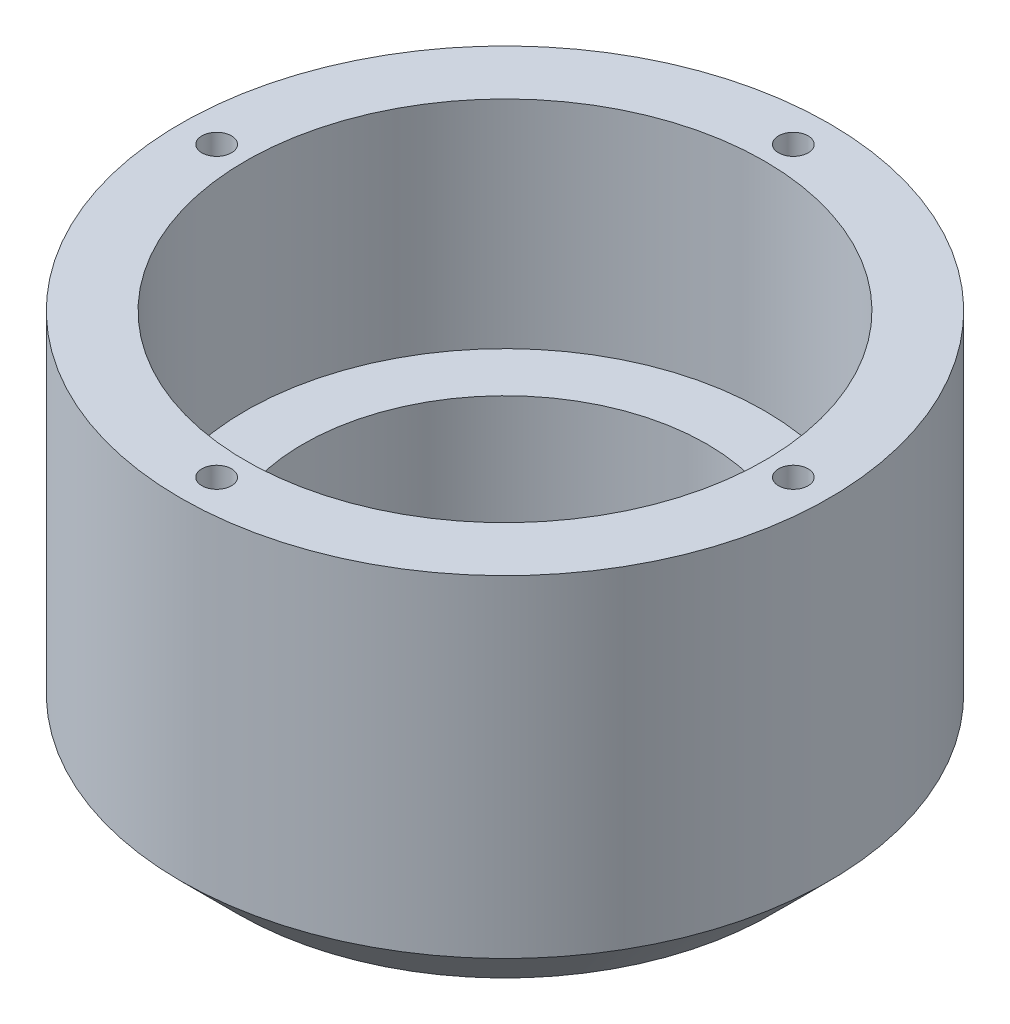
ISO-10303-21;
HEADER;
FILE_DESCRIPTION(('STEP AP214'),'2;1');
FILE_NAME('part.step','',(''),(''),'','','');
FILE_SCHEMA(('AUTOMOTIVE_DESIGN { 1 0 10303 214 1 1 1 1 }'));
ENDSEC;
DATA;
#1=APPLICATION_CONTEXT('core data for automotive mechanical design processes');
#2=APPLICATION_PROTOCOL_DEFINITION('international standard','automotive_design',2000,#1);
#3=PRODUCT_CONTEXT('',#1,'mechanical');
#4=PRODUCT('Part','Part','',(#3));
#5=PRODUCT_RELATED_PRODUCT_CATEGORY('part','',(#4));
#6=PRODUCT_DEFINITION_FORMATION('','',#4);
#7=PRODUCT_DEFINITION_CONTEXT('part definition',#1,'design');
#8=PRODUCT_DEFINITION('design','',#6,#7);
#9=PRODUCT_DEFINITION_SHAPE('','',#8);
#10=(LENGTH_UNIT() NAMED_UNIT(*) SI_UNIT(.MILLI.,.METRE.));
#11=(NAMED_UNIT(*) PLANE_ANGLE_UNIT() SI_UNIT($,.RADIAN.));
#12=(NAMED_UNIT(*) SI_UNIT($,.STERADIAN.) SOLID_ANGLE_UNIT());
#13=UNCERTAINTY_MEASURE_WITH_UNIT(LENGTH_MEASURE(1.E-05),#10,'distance_accuracy_value','');
#14=(GEOMETRIC_REPRESENTATION_CONTEXT(3) GLOBAL_UNCERTAINTY_ASSIGNED_CONTEXT((#13)) GLOBAL_UNIT_ASSIGNED_CONTEXT((#10,
#11,#12)) REPRESENTATION_CONTEXT('',''));
#15=CARTESIAN_POINT('',(0.,0.,0.));
#16=DIRECTION('',(0.,0.,1.));
#17=DIRECTION('',(1.,0.,0.));
#18=AXIS2_PLACEMENT_3D('',#15,#16,#17);
#19=CARTESIAN_POINT('',(0.,0.,0.));
#20=DIRECTION('',(0.,-1.,0.));
#21=DIRECTION('',(0.,0.,-1.));
#22=AXIS2_PLACEMENT_3D('',#19,#20,#21);
#23=CYLINDRICAL_SURFACE('',#22,18.);
#24=CARTESIAN_POINT('',(0.,15.,0.));
#25=DIRECTION('',(0.,-1.,0.));
#26=DIRECTION('',(0.,0.,-1.));
#27=AXIS2_PLACEMENT_3D('',#24,#25,#26);
#28=CIRCLE('',#27,18.);
#29=CARTESIAN_POINT('',(0.,15.,-18.));
#30=VERTEX_POINT('',#29);
#31=EDGE_CURVE('E111',#30,#30,#28,.T.);
#32=ORIENTED_EDGE('',*,*,#31,.F.);
#33=EDGE_LOOP('',(#32));
#34=FACE_BOUND('',#33,.T.);
#35=CARTESIAN_POINT('',(0.,0.,0.));
#36=DIRECTION('',(0.,-1.,0.));
#37=DIRECTION('',(0.,0.,-1.));
#38=AXIS2_PLACEMENT_3D('',#35,#36,#37);
#39=CIRCLE('',#38,18.);
#40=CARTESIAN_POINT('',(0.,0.,-18.));
#41=VERTEX_POINT('',#40);
#42=EDGE_CURVE('E95',#41,#41,#39,.T.);
#43=ORIENTED_EDGE('',*,*,#42,.T.);
#44=EDGE_LOOP('',(#43));
#45=FACE_BOUND('',#44,.T.);
#46=ADVANCED_FACE('F17',(#34,#45),#23,.F.);
#47=CARTESIAN_POINT('',(-22.5,15.,0.));
#48=DIRECTION('',(0.,-1.,0.));
#49=DIRECTION('',(0.,0.,-1.));
#50=AXIS2_PLACEMENT_3D('',#47,#48,#49);
#51=PLANE('',#50);
#52=CARTESIAN_POINT('',(-20.,15.,0.));
#53=DIRECTION('',(0.,1.,0.));
#54=DIRECTION('',(0.,0.,1.));
#55=AXIS2_PLACEMENT_3D('',#52,#53,#54);
#56=CIRCLE('',#55,1.025);
#57=CARTESIAN_POINT('',(-20.,15.,1.025));
#58=VERTEX_POINT('',#57);
#59=EDGE_CURVE('E65',#58,#58,#56,.T.);
#60=ORIENTED_EDGE('',*,*,#59,.F.);
#61=EDGE_LOOP('',(#60));
#62=FACE_BOUND('',#61,.T.);
#63=CARTESIAN_POINT('',(0.,15.,-20.));
#64=DIRECTION('',(0.,1.,0.));
#65=DIRECTION('',(0.,0.,1.));
#66=AXIS2_PLACEMENT_3D('',#63,#64,#65);
#67=CIRCLE('',#66,1.025);
#68=CARTESIAN_POINT('',(0.,15.,-18.975));
#69=VERTEX_POINT('',#68);
#70=EDGE_CURVE('E64',#69,#69,#67,.T.);
#71=ORIENTED_EDGE('',*,*,#70,.F.);
#72=EDGE_LOOP('',(#71));
#73=FACE_BOUND('',#72,.T.);
#74=CARTESIAN_POINT('',(20.,15.,1.39659253553725E-13));
#75=DIRECTION('',(0.,1.,0.));
#76=DIRECTION('',(0.,0.,1.));
#77=AXIS2_PLACEMENT_3D('',#74,#75,#76);
#78=CIRCLE('',#77,1.025);
#79=CARTESIAN_POINT('',(20.,15.,1.02500000000014));
#80=VERTEX_POINT('',#79);
#81=EDGE_CURVE('E79',#80,#80,#78,.T.);
#82=ORIENTED_EDGE('',*,*,#81,.F.);
#83=EDGE_LOOP('',(#82));
#84=FACE_BOUND('',#83,.T.);
#85=CARTESIAN_POINT('',(-2.09488880330588E-13,15.,20.));
#86=DIRECTION('',(0.,1.,0.));
#87=DIRECTION('',(0.,0.,1.));
#88=AXIS2_PLACEMENT_3D('',#85,#86,#87);
#89=CIRCLE('',#88,1.025);
#90=CARTESIAN_POINT('',(-2.09488880330588E-13,15.,21.025));
#91=VERTEX_POINT('',#90);
#92=EDGE_CURVE('E87',#91,#91,#89,.T.);
#93=ORIENTED_EDGE('',*,*,#92,.F.);
#94=EDGE_LOOP('',(#93));
#95=FACE_BOUND('',#94,.T.);
#96=CARTESIAN_POINT('',(0.,15.,0.));
#97=DIRECTION('',(0.,-1.,0.));
#98=DIRECTION('',(0.,0.,-1.));
#99=AXIS2_PLACEMENT_3D('',#96,#97,#98);
#100=CIRCLE('',#99,22.5);
#101=CARTESIAN_POINT('',(0.,15.,-22.5));
#102=VERTEX_POINT('',#101);
#103=EDGE_CURVE('E107',#102,#102,#100,.T.);
#104=ORIENTED_EDGE('',*,*,#103,.F.);
#105=EDGE_LOOP('',(#104));
#106=FACE_BOUND('',#105,.T.);
#107=ORIENTED_EDGE('',*,*,#31,.T.);
#108=EDGE_LOOP('',(#107));
#109=FACE_BOUND('',#108,.T.);
#110=ADVANCED_FACE('F131',(#62,#73,#84,#95,#106,#109),#51,.F.);
#111=CARTESIAN_POINT('',(0.,0.,0.));
#112=DIRECTION('',(0.,-1.,0.));
#113=DIRECTION('',(0.,0.,-1.));
#114=AXIS2_PLACEMENT_3D('',#111,#112,#113);
#115=CYLINDRICAL_SURFACE('',#114,22.5);
#116=CARTESIAN_POINT('',(0.,-8.,0.));
#117=DIRECTION('',(0.,1.,0.));
#118=DIRECTION('',(0.,0.,1.));
#119=AXIS2_PLACEMENT_3D('',#116,#117,#118);
#120=CIRCLE('',#119,22.5);
#121=CARTESIAN_POINT('',(0.,-8.,22.5));
#122=VERTEX_POINT('',#121);
#123=EDGE_CURVE('E11',#122,#122,#120,.T.);
#124=ORIENTED_EDGE('',*,*,#123,.T.);
#125=EDGE_LOOP('',(#124));
#126=FACE_BOUND('',#125,.T.);
#127=ORIENTED_EDGE('',*,*,#103,.T.);
#128=EDGE_LOOP('',(#127));
#129=FACE_BOUND('',#128,.T.);
#130=ADVANCED_FACE('F136',(#126,#129),#115,.T.);
#131=CARTESIAN_POINT('',(-14.,-12.,0.));
#132=DIRECTION('',(0.,1.,0.));
#133=DIRECTION('',(0.,0.,1.));
#134=AXIS2_PLACEMENT_3D('',#131,#132,#133);
#135=PLANE('',#134);
#136=CARTESIAN_POINT('',(0.,-12.,0.));
#137=DIRECTION('',(0.,1.,0.));
#138=DIRECTION('',(0.,0.,1.));
#139=AXIS2_PLACEMENT_3D('',#136,#137,#138);
#140=CIRCLE('',#139,18.5);
#141=CARTESIAN_POINT('',(0.,-12.,18.5));
#142=VERTEX_POINT('',#141);
#143=EDGE_CURVE('E26',#142,#142,#140,.F.);
#144=ORIENTED_EDGE('',*,*,#143,.T.);
#145=EDGE_LOOP('',(#144));
#146=FACE_BOUND('',#145,.T.);
#147=CARTESIAN_POINT('',(0.,-12.,0.));
#148=DIRECTION('',(0.,-1.,0.));
#149=DIRECTION('',(0.,0.,-1.));
#150=AXIS2_PLACEMENT_3D('',#147,#148,#149);
#151=CIRCLE('',#150,14.);
#152=CARTESIAN_POINT('',(0.,-12.,-14.));
#153=VERTEX_POINT('',#152);
#154=EDGE_CURVE('E103',#153,#153,#151,.T.);
#155=ORIENTED_EDGE('',*,*,#154,.F.);
#156=EDGE_LOOP('',(#155));
#157=FACE_BOUND('',#156,.T.);
#158=ADVANCED_FACE('F119',(#146,#157),#135,.F.);
#159=CARTESIAN_POINT('',(0.,0.,0.));
#160=DIRECTION('',(0.,-1.,0.));
#161=DIRECTION('',(0.,0.,-1.));
#162=AXIS2_PLACEMENT_3D('',#159,#160,#161);
#163=CYLINDRICAL_SURFACE('',#162,14.);
#164=CARTESIAN_POINT('',(0.,0.,0.));
#165=DIRECTION('',(0.,-1.,0.));
#166=DIRECTION('',(0.,0.,-1.));
#167=AXIS2_PLACEMENT_3D('',#164,#165,#166);
#168=CIRCLE('',#167,14.);
#169=CARTESIAN_POINT('',(0.,0.,-14.));
#170=VERTEX_POINT('',#169);
#171=EDGE_CURVE('E99',#170,#170,#168,.T.);
#172=ORIENTED_EDGE('',*,*,#171,.F.);
#173=EDGE_LOOP('',(#172));
#174=FACE_BOUND('',#173,.T.);
#175=ORIENTED_EDGE('',*,*,#154,.T.);
#176=EDGE_LOOP('',(#175));
#177=FACE_BOUND('',#176,.T.);
#178=ADVANCED_FACE('F147',(#174,#177),#163,.F.);
#179=CARTESIAN_POINT('',(-18.,0.,0.));
#180=DIRECTION('',(0.,-1.,0.));
#181=DIRECTION('',(0.,0.,-1.));
#182=AXIS2_PLACEMENT_3D('',#179,#180,#181);
#183=PLANE('',#182);
#184=ORIENTED_EDGE('',*,*,#42,.F.);
#185=EDGE_LOOP('',(#184));
#186=FACE_BOUND('',#185,.T.);
#187=ORIENTED_EDGE('',*,*,#171,.T.);
#188=EDGE_LOOP('',(#187));
#189=FACE_BOUND('',#188,.T.);
#190=ADVANCED_FACE('F150',(#186,#189),#183,.F.);
#191=CARTESIAN_POINT('',(-2.09488880330588E-13,5.,20.));
#192=DIRECTION('',(0.,1.,0.));
#193=DIRECTION('',(0.,0.,1.));
#194=AXIS2_PLACEMENT_3D('',#191,#192,#193);
#195=CONICAL_SURFACE('',#194,1.025,1.02974425867665);
#196=CARTESIAN_POINT('',(-2.12089021545817E-13,4.38411786549675,20.));
#197=VERTEX_POINT('',#196);
#198=VERTEX_LOOP('',#197);
#199=FACE_BOUND('',#198,.T.);
#200=CARTESIAN_POINT('',(-2.09488880330588E-13,5.,20.));
#201=DIRECTION('',(0.,1.,0.));
#202=DIRECTION('',(0.,0.,1.));
#203=AXIS2_PLACEMENT_3D('',#200,#201,#202);
#204=CIRCLE('',#203,1.025);
#205=CARTESIAN_POINT('',(-2.09488880330588E-13,5.,21.025));
#206=VERTEX_POINT('',#205);
#207=EDGE_CURVE('E91',#206,#206,#204,.T.);
#208=ORIENTED_EDGE('',*,*,#207,.T.);
#209=EDGE_LOOP('',(#208));
#210=FACE_BOUND('',#209,.T.);
#211=ADVANCED_FACE('F154',(#199,#210),#195,.F.);
#212=CARTESIAN_POINT('',(-2.09488880330588E-13,15.,20.));
#213=DIRECTION('',(0.,1.,0.));
#214=DIRECTION('',(0.,0.,1.));
#215=AXIS2_PLACEMENT_3D('',#212,#213,#214);
#216=CYLINDRICAL_SURFACE('',#215,1.025);
#217=ORIENTED_EDGE('',*,*,#207,.F.);
#218=EDGE_LOOP('',(#217));
#219=FACE_BOUND('',#218,.T.);
#220=ORIENTED_EDGE('',*,*,#92,.T.);
#221=EDGE_LOOP('',(#220));
#222=FACE_BOUND('',#221,.T.);
#223=ADVANCED_FACE('F158',(#219,#222),#216,.F.);
#224=CARTESIAN_POINT('',(20.,5.,1.39659253553725E-13));
#225=DIRECTION('',(0.,1.,0.));
#226=DIRECTION('',(0.,0.,1.));
#227=AXIS2_PLACEMENT_3D('',#224,#225,#226);
#228=CONICAL_SURFACE('',#227,1.025,1.02974425867665);
#229=CARTESIAN_POINT('',(20.,4.38411786549675,1.39659253553725E-13));
#230=VERTEX_POINT('',#229);
#231=VERTEX_LOOP('',#230);
#232=FACE_BOUND('',#231,.T.);
#233=CARTESIAN_POINT('',(20.,5.,1.39659253553725E-13));
#234=DIRECTION('',(0.,1.,0.));
#235=DIRECTION('',(0.,0.,1.));
#236=AXIS2_PLACEMENT_3D('',#233,#234,#235);
#237=CIRCLE('',#236,1.025);
#238=CARTESIAN_POINT('',(20.,5.,1.02500000000014));
#239=VERTEX_POINT('',#238);
#240=EDGE_CURVE('E83',#239,#239,#237,.T.);
#241=ORIENTED_EDGE('',*,*,#240,.T.);
#242=EDGE_LOOP('',(#241));
#243=FACE_BOUND('',#242,.T.);
#244=ADVANCED_FACE('F161',(#232,#243),#228,.F.);
#245=CARTESIAN_POINT('',(20.,15.,1.39659253553725E-13));
#246=DIRECTION('',(0.,1.,0.));
#247=DIRECTION('',(0.,0.,1.));
#248=AXIS2_PLACEMENT_3D('',#245,#246,#247);
#249=CYLINDRICAL_SURFACE('',#248,1.025);
#250=ORIENTED_EDGE('',*,*,#240,.F.);
#251=EDGE_LOOP('',(#250));
#252=FACE_BOUND('',#251,.T.);
#253=ORIENTED_EDGE('',*,*,#81,.T.);
#254=EDGE_LOOP('',(#253));
#255=FACE_BOUND('',#254,.T.);
#256=ADVANCED_FACE('F165',(#252,#255),#249,.F.);
#257=CARTESIAN_POINT('',(0.,5.,-20.));
#258=DIRECTION('',(0.,1.,0.));
#259=DIRECTION('',(0.,0.,1.));
#260=AXIS2_PLACEMENT_3D('',#257,#258,#259);
#261=CONICAL_SURFACE('',#260,1.025,1.02974425867665);
#262=CARTESIAN_POINT('',(0.,4.38411786549675,-20.));
#263=VERTEX_POINT('',#262);
#264=VERTEX_LOOP('',#263);
#265=FACE_BOUND('',#264,.T.);
#266=CARTESIAN_POINT('',(0.,5.,-20.));
#267=DIRECTION('',(0.,1.,0.));
#268=DIRECTION('',(0.,0.,1.));
#269=AXIS2_PLACEMENT_3D('',#266,#267,#268);
#270=CIRCLE('',#269,1.025);
#271=CARTESIAN_POINT('',(0.,5.,-18.975));
#272=VERTEX_POINT('',#271);
#273=EDGE_CURVE('E71',#272,#272,#270,.T.);
#274=ORIENTED_EDGE('',*,*,#273,.T.);
#275=EDGE_LOOP('',(#274));
#276=FACE_BOUND('',#275,.T.);
#277=ADVANCED_FACE('F168',(#265,#276),#261,.F.);
#278=CARTESIAN_POINT('',(0.,15.,-20.));
#279=DIRECTION('',(0.,1.,0.));
#280=DIRECTION('',(0.,0.,1.));
#281=AXIS2_PLACEMENT_3D('',#278,#279,#280);
#282=CYLINDRICAL_SURFACE('',#281,1.025);
#283=ORIENTED_EDGE('',*,*,#273,.F.);
#284=EDGE_LOOP('',(#283));
#285=FACE_BOUND('',#284,.T.);
#286=ORIENTED_EDGE('',*,*,#70,.T.);
#287=EDGE_LOOP('',(#286));
#288=FACE_BOUND('',#287,.T.);
#289=ADVANCED_FACE('F57',(#285,#288),#282,.F.);
#290=CARTESIAN_POINT('',(-20.,5.,0.));
#291=DIRECTION('',(0.,1.,0.));
#292=DIRECTION('',(0.,0.,1.));
#293=AXIS2_PLACEMENT_3D('',#290,#291,#292);
#294=CONICAL_SURFACE('',#293,1.025,1.02974425867665);
#295=CARTESIAN_POINT('',(-20.,4.38411786549675,0.));
#296=VERTEX_POINT('',#295);
#297=VERTEX_LOOP('',#296);
#298=FACE_BOUND('',#297,.T.);
#299=CARTESIAN_POINT('',(-20.,5.,0.));
#300=DIRECTION('',(0.,1.,0.));
#301=DIRECTION('',(0.,0.,1.));
#302=AXIS2_PLACEMENT_3D('',#299,#300,#301);
#303=CIRCLE('',#302,1.025);
#304=CARTESIAN_POINT('',(-20.,5.,1.025));
#305=VERTEX_POINT('',#304);
#306=EDGE_CURVE('E61',#305,#305,#303,.T.);
#307=ORIENTED_EDGE('',*,*,#306,.T.);
#308=EDGE_LOOP('',(#307));
#309=FACE_BOUND('',#308,.T.);
#310=ADVANCED_FACE('F53',(#298,#309),#294,.F.);
#311=CARTESIAN_POINT('',(-20.,15.,0.));
#312=DIRECTION('',(0.,1.,0.));
#313=DIRECTION('',(0.,0.,1.));
#314=AXIS2_PLACEMENT_3D('',#311,#312,#313);
#315=CYLINDRICAL_SURFACE('',#314,1.025);
#316=ORIENTED_EDGE('',*,*,#306,.F.);
#317=EDGE_LOOP('',(#316));
#318=FACE_BOUND('',#317,.T.);
#319=ORIENTED_EDGE('',*,*,#59,.T.);
#320=EDGE_LOOP('',(#319));
#321=FACE_BOUND('',#320,.T.);
#322=ADVANCED_FACE('F56',(#318,#321),#315,.F.);
#323=CARTESIAN_POINT('',(0.,-12.,0.));
#324=DIRECTION('',(0.,1.,0.));
#325=DIRECTION('',(0.,0.,1.));
#326=AXIS2_PLACEMENT_3D('',#323,#324,#325);
#327=CONICAL_SURFACE('',#326,18.5,0.785398163397445);
#328=ORIENTED_EDGE('',*,*,#123,.F.);
#329=EDGE_LOOP('',(#328));
#330=FACE_BOUND('',#329,.T.);
#331=ORIENTED_EDGE('',*,*,#143,.F.);
#332=EDGE_LOOP('',(#331));
#333=FACE_BOUND('',#332,.T.);
#334=ADVANCED_FACE('F19',(#330,#333),#327,.T.);
#335=CLOSED_SHELL('',(#46,#110,#130,#158,#178,#190,#211,#223,#244,#256,#277,#289,#310,#322,#334));
#336=MANIFOLD_SOLID_BREP('B1',#335);
#337=ADVANCED_BREP_SHAPE_REPRESENTATION('',(#18,#336),#14);
#338=SHAPE_DEFINITION_REPRESENTATION(#9,#337);
ENDSEC;
END-ISO-10303-21;
